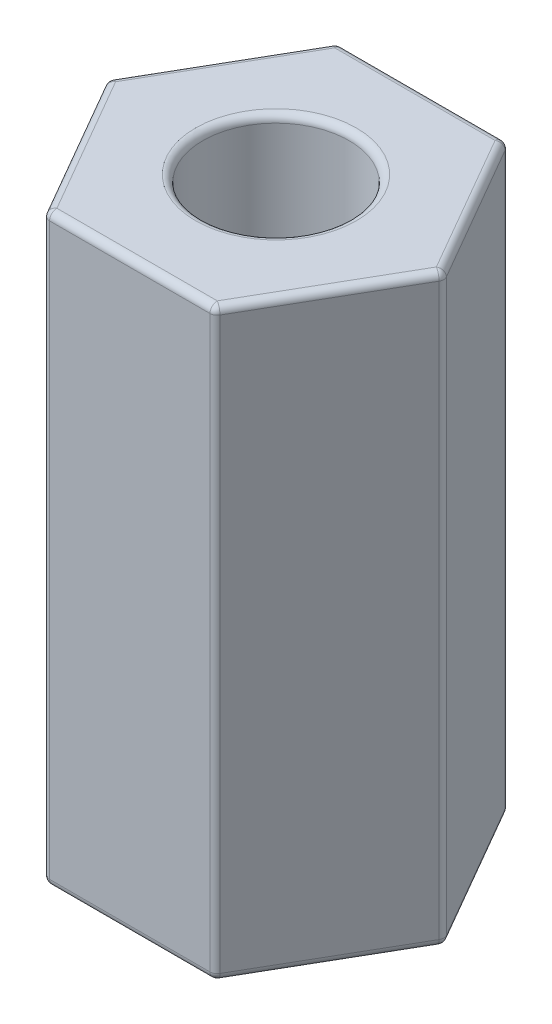
ISO-10303-21;
HEADER;
FILE_DESCRIPTION(('STEP AP214'),'2;1');
FILE_NAME('part.step','',(''),(''),'','','');
FILE_SCHEMA(('AUTOMOTIVE_DESIGN { 1 0 10303 214 1 1 1 1 }'));
ENDSEC;
DATA;
#1=APPLICATION_CONTEXT('core data for automotive mechanical design processes');
#2=APPLICATION_PROTOCOL_DEFINITION('international standard','automotive_design',2000,#1);
#3=PRODUCT_CONTEXT('',#1,'mechanical');
#4=PRODUCT('Part','Part','',(#3));
#5=PRODUCT_RELATED_PRODUCT_CATEGORY('part','',(#4));
#6=PRODUCT_DEFINITION_FORMATION('','',#4);
#7=PRODUCT_DEFINITION_CONTEXT('part definition',#1,'design');
#8=PRODUCT_DEFINITION('design','',#6,#7);
#9=PRODUCT_DEFINITION_SHAPE('','',#8);
#10=(LENGTH_UNIT() NAMED_UNIT(*) SI_UNIT(.MILLI.,.METRE.));
#11=(NAMED_UNIT(*) PLANE_ANGLE_UNIT() SI_UNIT($,.RADIAN.));
#12=(NAMED_UNIT(*) SI_UNIT($,.STERADIAN.) SOLID_ANGLE_UNIT());
#13=UNCERTAINTY_MEASURE_WITH_UNIT(LENGTH_MEASURE(1.E-05),#10,'distance_accuracy_value','');
#14=(GEOMETRIC_REPRESENTATION_CONTEXT(3) GLOBAL_UNCERTAINTY_ASSIGNED_CONTEXT((#13)) GLOBAL_UNIT_ASSIGNED_CONTEXT((#10,
#11,#12)) REPRESENTATION_CONTEXT('',''));
#15=CARTESIAN_POINT('',(0.,0.,0.));
#16=DIRECTION('',(0.,0.,1.));
#17=DIRECTION('',(1.,0.,0.));
#18=AXIS2_PLACEMENT_3D('',#15,#16,#17);
#19=CARTESIAN_POINT('',(-1.154700538379,0.,2.));
#20=DIRECTION('',(0.,0.,1.));
#21=DIRECTION('',(1.,0.,0.));
#22=AXIS2_PLACEMENT_3D('',#19,#20,#21);
#23=PLANE('',#22);
#24=DIRECTION('',(0.,1.,0.));
#25=VECTOR('',#24,1.);
#26=CARTESIAN_POINT('',(-1.09696551146074,0.,2.));
#27=LINE('',#26,#25);
#28=CARTESIAN_POINT('',(-1.09696551146074,7.9,2.));
#29=VERTEX_POINT('',#28);
#30=CARTESIAN_POINT('',(-1.09696551146074,0.1,2.));
#31=VERTEX_POINT('',#30);
#32=EDGE_CURVE('E350',#29,#31,#27,.F.);
#33=ORIENTED_EDGE('',*,*,#32,.T.);
#34=DIRECTION('',(1.,0.,0.));
#35=VECTOR('',#34,1.);
#36=CARTESIAN_POINT('',(1.09696551146004,0.1,2.));
#37=LINE('',#36,#35);
#38=CARTESIAN_POINT('',(1.09696551146004,0.1,2.));
#39=VERTEX_POINT('',#38);
#40=EDGE_CURVE('E319',#31,#39,#37,.T.);
#41=ORIENTED_EDGE('',*,*,#40,.T.);
#42=DIRECTION('',(0.,-1.,0.));
#43=VECTOR('',#42,1.);
#44=CARTESIAN_POINT('',(1.09696551146004,0.,2.));
#45=LINE('',#44,#43);
#46=CARTESIAN_POINT('',(1.09696551146004,7.9,2.));
#47=VERTEX_POINT('',#46);
#48=EDGE_CURVE('E353',#39,#47,#45,.F.);
#49=ORIENTED_EDGE('',*,*,#48,.T.);
#50=DIRECTION('',(1.,0.,0.));
#51=VECTOR('',#50,1.);
#52=CARTESIAN_POINT('',(-1.154700538379,7.9,2.));
#53=LINE('',#52,#51);
#54=EDGE_CURVE('E321',#47,#29,#53,.F.);
#55=ORIENTED_EDGE('',*,*,#54,.T.);
#56=EDGE_LOOP('',(#33,#41,#49,#55));
#57=FACE_BOUND('',#56,.T.);
#58=ADVANCED_FACE('F33',(#57),#23,.T.);
#59=CARTESIAN_POINT('',(1.154700538379,0.,2.));
#60=DIRECTION('',(0.866025403784429,0.,0.500000000000017));
#61=DIRECTION('',(0.500000000000017,0.,-0.866025403784429));
#62=AXIS2_PLACEMENT_3D('',#59,#60,#61);
#63=PLANE('',#62);
#64=DIRECTION('',(0.,-1.,0.));
#65=VECTOR('',#64,1.);
#66=CARTESIAN_POINT('',(1.18356805183848,0.,1.95));
#67=LINE('',#66,#65);
#68=CARTESIAN_POINT('',(1.18356805183848,7.9,1.95));
#69=VERTEX_POINT('',#68);
#70=CARTESIAN_POINT('',(1.18356805183848,0.1,1.95));
#71=VERTEX_POINT('',#70);
#72=EDGE_CURVE('E344',#69,#71,#67,.T.);
#73=ORIENTED_EDGE('',*,*,#72,.T.);
#74=DIRECTION('',(0.500000000000017,0.,-0.866025403784429));
#75=VECTOR('',#74,1.);
#76=CARTESIAN_POINT('',(2.28053356329917,0.1,0.0499999999993974));
#77=LINE('',#76,#75);
#78=CARTESIAN_POINT('',(2.28053356329917,0.1,0.049999999999398));
#79=VERTEX_POINT('',#78);
#80=EDGE_CURVE('E311',#71,#79,#77,.T.);
#81=ORIENTED_EDGE('',*,*,#80,.T.);
#82=DIRECTION('',(0.,-1.,0.));
#83=VECTOR('',#82,1.);
#84=CARTESIAN_POINT('',(2.28053356329917,0.,0.049999999999398));
#85=LINE('',#84,#83);
#86=CARTESIAN_POINT('',(2.28053356329917,7.9,0.049999999999398));
#87=VERTEX_POINT('',#86);
#88=EDGE_CURVE('E347',#79,#87,#85,.F.);
#89=ORIENTED_EDGE('',*,*,#88,.T.);
#90=DIRECTION('',(0.500000000000017,0.,-0.866025403784429));
#91=VECTOR('',#90,1.);
#92=CARTESIAN_POINT('',(1.154700538379,7.9,2.));
#93=LINE('',#92,#91);
#94=EDGE_CURVE('E313',#87,#69,#93,.F.);
#95=ORIENTED_EDGE('',*,*,#94,.T.);
#96=EDGE_LOOP('',(#73,#81,#89,#95));
#97=FACE_BOUND('',#96,.T.);
#98=ADVANCED_FACE('F461',(#97),#63,.T.);
#99=CARTESIAN_POINT('',(2.309401076759,0.,0.));
#100=DIRECTION('',(0.866025403784429,0.,-0.500000000000017));
#101=DIRECTION('',(-0.500000000000017,0.,-0.866025403784429));
#102=AXIS2_PLACEMENT_3D('',#99,#100,#101);
#103=PLANE('',#102);
#104=DIRECTION('',(0.,-1.,0.));
#105=VECTOR('',#104,1.);
#106=CARTESIAN_POINT('',(2.28053356329917,0.,-0.0500000000006048));
#107=LINE('',#106,#105);
#108=CARTESIAN_POINT('',(2.28053356329917,7.9,-0.0500000000006048));
#109=VERTEX_POINT('',#108);
#110=CARTESIAN_POINT('',(2.28053356329917,0.1,-0.0500000000006048));
#111=VERTEX_POINT('',#110);
#112=EDGE_CURVE('E359',#109,#111,#107,.T.);
#113=ORIENTED_EDGE('',*,*,#112,.T.);
#114=DIRECTION('',(-0.500000000000017,0.,-0.866025403784429));
#115=VECTOR('',#114,1.);
#116=CARTESIAN_POINT('',(1.18356805183918,0.1,-1.95));
#117=LINE('',#116,#115);
#118=CARTESIAN_POINT('',(1.18356805183918,0.1,-1.95));
#119=VERTEX_POINT('',#118);
#120=EDGE_CURVE('E303',#111,#119,#117,.T.);
#121=ORIENTED_EDGE('',*,*,#120,.T.);
#122=DIRECTION('',(0.,-1.,0.));
#123=VECTOR('',#122,1.);
#124=CARTESIAN_POINT('',(1.18356805183918,0.,-1.95));
#125=LINE('',#124,#123);
#126=CARTESIAN_POINT('',(1.18356805183918,7.9,-1.95));
#127=VERTEX_POINT('',#126);
#128=EDGE_CURVE('E356',#119,#127,#125,.F.);
#129=ORIENTED_EDGE('',*,*,#128,.T.);
#130=DIRECTION('',(-0.500000000000017,0.,-0.866025403784429));
#131=VECTOR('',#130,1.);
#132=CARTESIAN_POINT('',(2.309401076759,7.9,0.));
#133=LINE('',#132,#131);
#134=EDGE_CURVE('E305',#127,#109,#133,.F.);
#135=ORIENTED_EDGE('',*,*,#134,.T.);
#136=EDGE_LOOP('',(#113,#121,#129,#135));
#137=FACE_BOUND('',#136,.T.);
#138=ADVANCED_FACE('F416',(#137),#103,.T.);
#139=CARTESIAN_POINT('',(1.154700538379,0.,-2.));
#140=DIRECTION('',(0.,0.,-1.));
#141=DIRECTION('',(-1.,0.,0.));
#142=AXIS2_PLACEMENT_3D('',#139,#140,#141);
#143=PLANE('',#142);
#144=DIRECTION('',(0.,-1.,0.));
#145=VECTOR('',#144,1.);
#146=CARTESIAN_POINT('',(1.09696551146074,0.,-2.));
#147=LINE('',#146,#145);
#148=CARTESIAN_POINT('',(1.09696551146074,7.9,-2.));
#149=VERTEX_POINT('',#148);
#150=CARTESIAN_POINT('',(1.09696551146074,0.1,-2.));
#151=VERTEX_POINT('',#150);
#152=EDGE_CURVE('E370',#149,#151,#147,.T.);
#153=ORIENTED_EDGE('',*,*,#152,.T.);
#154=DIRECTION('',(-1.,0.,0.));
#155=VECTOR('',#154,1.);
#156=CARTESIAN_POINT('',(-1.09696551146004,0.1,-2.));
#157=LINE('',#156,#155);
#158=CARTESIAN_POINT('',(-1.09696551146004,0.1,-2.));
#159=VERTEX_POINT('',#158);
#160=EDGE_CURVE('E294',#151,#159,#157,.T.);
#161=ORIENTED_EDGE('',*,*,#160,.T.);
#162=DIRECTION('',(0.,-1.,0.));
#163=VECTOR('',#162,1.);
#164=CARTESIAN_POINT('',(-1.09696551146004,0.,-2.));
#165=LINE('',#164,#163);
#166=CARTESIAN_POINT('',(-1.09696551146004,7.9,-2.));
#167=VERTEX_POINT('',#166);
#168=EDGE_CURVE('E367',#159,#167,#165,.F.);
#169=ORIENTED_EDGE('',*,*,#168,.T.);
#170=DIRECTION('',(-1.,0.,0.));
#171=VECTOR('',#170,1.);
#172=CARTESIAN_POINT('',(1.154700538379,7.9,-2.));
#173=LINE('',#172,#171);
#174=EDGE_CURVE('E296',#167,#149,#173,.F.);
#175=ORIENTED_EDGE('',*,*,#174,.T.);
#176=EDGE_LOOP('',(#153,#161,#169,#175));
#177=FACE_BOUND('',#176,.T.);
#178=ADVANCED_FACE('F376',(#177),#143,.T.);
#179=CARTESIAN_POINT('',(-1.154700538379,0.,-2.));
#180=DIRECTION('',(-0.866025403784429,0.,-0.500000000000017));
#181=DIRECTION('',(-0.500000000000017,0.,0.866025403784429));
#182=AXIS2_PLACEMENT_3D('',#179,#180,#181);
#183=PLANE('',#182);
#184=DIRECTION('',(0.,-1.,0.));
#185=VECTOR('',#184,1.);
#186=CARTESIAN_POINT('',(-1.18356805183848,0.,-1.95));
#187=LINE('',#186,#185);
#188=CARTESIAN_POINT('',(-1.18356805183848,7.9,-1.95));
#189=VERTEX_POINT('',#188);
#190=CARTESIAN_POINT('',(-1.18356805183848,0.1,-1.95));
#191=VERTEX_POINT('',#190);
#192=EDGE_CURVE('E165',#189,#191,#187,.T.);
#193=ORIENTED_EDGE('',*,*,#192,.T.);
#194=DIRECTION('',(-0.500000000000017,0.,0.866025403784429));
#195=VECTOR('',#194,1.);
#196=CARTESIAN_POINT('',(-2.28053356329917,0.1,-0.0499999999993974));
#197=LINE('',#196,#195);
#198=CARTESIAN_POINT('',(-2.28053356329917,0.1,-0.049999999999398));
#199=VERTEX_POINT('',#198);
#200=EDGE_CURVE('E159',#191,#199,#197,.T.);
#201=ORIENTED_EDGE('',*,*,#200,.T.);
#202=DIRECTION('',(0.,-1.,0.));
#203=VECTOR('',#202,1.);
#204=CARTESIAN_POINT('',(-2.28053356329917,0.,-0.049999999999398));
#205=LINE('',#204,#203);
#206=CARTESIAN_POINT('',(-2.28053356329917,7.9,-0.049999999999398));
#207=VERTEX_POINT('',#206);
#208=EDGE_CURVE('E162',#199,#207,#205,.F.);
#209=ORIENTED_EDGE('',*,*,#208,.T.);
#210=DIRECTION('',(-0.500000000000017,0.,0.866025403784429));
#211=VECTOR('',#210,1.);
#212=CARTESIAN_POINT('',(-1.154700538379,7.9,-2.));
#213=LINE('',#212,#211);
#214=EDGE_CURVE('E171',#207,#189,#213,.F.);
#215=ORIENTED_EDGE('',*,*,#214,.T.);
#216=EDGE_LOOP('',(#193,#201,#209,#215));
#217=FACE_BOUND('',#216,.T.);
#218=ADVANCED_FACE('F161',(#217),#183,.T.);
#219=CARTESIAN_POINT('',(-2.309401076759,0.,0.));
#220=DIRECTION('',(-0.866025403784429,0.,0.500000000000017));
#221=DIRECTION('',(0.500000000000017,0.,0.866025403784429));
#222=AXIS2_PLACEMENT_3D('',#219,#220,#221);
#223=PLANE('',#222);
#224=DIRECTION('',(0.,-1.,0.));
#225=VECTOR('',#224,1.);
#226=CARTESIAN_POINT('',(-2.28053356329917,0.,0.0500000000006048));
#227=LINE('',#226,#225);
#228=CARTESIAN_POINT('',(-2.28053356329917,7.9,0.0500000000006048));
#229=VERTEX_POINT('',#228);
#230=CARTESIAN_POINT('',(-2.28053356329917,0.1,0.0500000000006048));
#231=VERTEX_POINT('',#230);
#232=EDGE_CURVE('E362',#229,#231,#227,.T.);
#233=ORIENTED_EDGE('',*,*,#232,.T.);
#234=DIRECTION('',(0.500000000000017,0.,0.866025403784429));
#235=VECTOR('',#234,1.);
#236=CARTESIAN_POINT('',(-1.18356805183918,0.1,1.95));
#237=LINE('',#236,#235);
#238=CARTESIAN_POINT('',(-1.18356805183918,0.1,1.95));
#239=VERTEX_POINT('',#238);
#240=EDGE_CURVE('E340',#231,#239,#237,.T.);
#241=ORIENTED_EDGE('',*,*,#240,.T.);
#242=DIRECTION('',(0.,1.,0.));
#243=VECTOR('',#242,1.);
#244=CARTESIAN_POINT('',(-1.18356805183918,0.,1.95));
#245=LINE('',#244,#243);
#246=CARTESIAN_POINT('',(-1.18356805183918,7.9,1.95));
#247=VERTEX_POINT('',#246);
#248=EDGE_CURVE('E364',#239,#247,#245,.T.);
#249=ORIENTED_EDGE('',*,*,#248,.T.);
#250=DIRECTION('',(0.500000000000017,0.,0.866025403784429));
#251=VECTOR('',#250,1.);
#252=CARTESIAN_POINT('',(-2.309401076759,7.9,0.));
#253=LINE('',#252,#251);
#254=EDGE_CURVE('E190',#247,#229,#253,.F.);
#255=ORIENTED_EDGE('',*,*,#254,.T.);
#256=EDGE_LOOP('',(#233,#241,#249,#255));
#257=FACE_BOUND('',#256,.T.);
#258=ADVANCED_FACE('F436',(#257),#223,.T.);
#259=CARTESIAN_POINT('',(0.,0.,0.));
#260=DIRECTION('',(0.,1.,0.));
#261=DIRECTION('',(0.,0.,1.));
#262=AXIS2_PLACEMENT_3D('',#259,#260,#261);
#263=PLANE('',#262);
#264=DIRECTION('',(1.,0.,0.));
#265=VECTOR('',#264,1.);
#266=CARTESIAN_POINT('',(-1.09696551146074,0.,1.9));
#267=LINE('',#266,#265);
#268=CARTESIAN_POINT('',(1.09696551146004,0.,1.9));
#269=VERTEX_POINT('',#268);
#270=CARTESIAN_POINT('',(-1.09696551146074,0.,1.9));
#271=VERTEX_POINT('',#270);
#272=EDGE_CURVE('E328',#269,#271,#267,.F.);
#273=ORIENTED_EDGE('',*,*,#272,.T.);
#274=DIRECTION('',(0.500000000000017,0.,0.866025403784429));
#275=VECTOR('',#274,1.);
#276=CARTESIAN_POINT('',(-2.19393102292073,0.,6.03053577127172E-13));
#277=LINE('',#276,#275);
#278=CARTESIAN_POINT('',(-2.19393102292073,0.,6.03385614042495E-13));
#279=VERTEX_POINT('',#278);
#280=EDGE_CURVE('E326',#271,#279,#277,.F.);
#281=ORIENTED_EDGE('',*,*,#280,.T.);
#282=DIRECTION('',(-0.500000000000017,0.,0.866025403784429));
#283=VECTOR('',#282,1.);
#284=CARTESIAN_POINT('',(-1.09696551146004,0.,-1.9));
#285=LINE('',#284,#283);
#286=CARTESIAN_POINT('',(-1.09696551146004,0.,-1.9));
#287=VERTEX_POINT('',#286);
#288=EDGE_CURVE('E194',#279,#287,#285,.F.);
#289=ORIENTED_EDGE('',*,*,#288,.T.);
#290=DIRECTION('',(-1.,0.,0.));
#291=VECTOR('',#290,1.);
#292=CARTESIAN_POINT('',(1.09696551146074,0.,-1.9));
#293=LINE('',#292,#291);
#294=CARTESIAN_POINT('',(1.09696551146074,0.,-1.9));
#295=VERTEX_POINT('',#294);
#296=EDGE_CURVE('E334',#287,#295,#293,.F.);
#297=ORIENTED_EDGE('',*,*,#296,.T.);
#298=DIRECTION('',(-0.500000000000017,0.,-0.866025403784429));
#299=VECTOR('',#298,1.);
#300=CARTESIAN_POINT('',(2.19393102292073,0.,-6.03053577127172E-13));
#301=LINE('',#300,#299);
#302=CARTESIAN_POINT('',(2.19393102292073,0.,-6.03221289650728E-13));
#303=VERTEX_POINT('',#302);
#304=EDGE_CURVE('E332',#295,#303,#301,.F.);
#305=ORIENTED_EDGE('',*,*,#304,.T.);
#306=DIRECTION('',(0.500000000000017,0.,-0.866025403784429));
#307=VECTOR('',#306,1.);
#308=CARTESIAN_POINT('',(1.09696551146004,0.,1.9));
#309=LINE('',#308,#307);
#310=EDGE_CURVE('E330',#303,#269,#309,.F.);
#311=ORIENTED_EDGE('',*,*,#310,.T.);
#312=EDGE_LOOP('',(#273,#281,#289,#297,#305,#311));
#313=FACE_BOUND('',#312,.T.);
#314=CARTESIAN_POINT('',(0.,0.,0.));
#315=DIRECTION('',(0.,1.,0.));
#316=DIRECTION('',(0.,0.,1.));
#317=AXIS2_PLACEMENT_3D('',#314,#315,#316);
#318=CIRCLE('',#317,1.1);
#319=CARTESIAN_POINT('',(0.,0.,1.1));
#320=VERTEX_POINT('',#319);
#321=EDGE_CURVE('E337',#320,#320,#318,.T.);
#322=ORIENTED_EDGE('',*,*,#321,.T.);
#323=EDGE_LOOP('',(#322));
#324=FACE_BOUND('',#323,.T.);
#325=ADVANCED_FACE('F424',(#313,#324),#263,.F.);
#326=CARTESIAN_POINT('',(0.,8.,0.));
#327=DIRECTION('',(0.,1.,0.));
#328=DIRECTION('',(0.,0.,1.));
#329=AXIS2_PLACEMENT_3D('',#326,#327,#328);
#330=PLANE('',#329);
#331=DIRECTION('',(0.500000000000017,0.,-0.866025403784429));
#332=VECTOR('',#331,1.);
#333=CARTESIAN_POINT('',(1.64544826719025,8.,0.949999999999934));
#334=LINE('',#333,#332);
#335=CARTESIAN_POINT('',(1.09696551146004,8.,1.9));
#336=VERTEX_POINT('',#335);
#337=CARTESIAN_POINT('',(2.19393102292073,8.,-6.03191048454075E-13));
#338=VERTEX_POINT('',#337);
#339=EDGE_CURVE('E42',#336,#338,#334,.T.);
#340=ORIENTED_EDGE('',*,*,#339,.T.);
#341=DIRECTION('',(-0.500000000000017,0.,-0.866025403784429));
#342=VECTOR('',#341,1.);
#343=CARTESIAN_POINT('',(1.64544826719077,8.,-0.950000000000236));
#344=LINE('',#343,#342);
#345=CARTESIAN_POINT('',(1.09696551146074,8.,-1.9));
#346=VERTEX_POINT('',#345);
#347=EDGE_CURVE('E11',#338,#346,#344,.T.);
#348=ORIENTED_EDGE('',*,*,#347,.T.);
#349=DIRECTION('',(-1.,0.,0.));
#350=VECTOR('',#349,1.);
#351=CARTESIAN_POINT('',(0.,8.,-1.9));
#352=LINE('',#351,#350);
#353=CARTESIAN_POINT('',(-1.09696551146004,8.,-1.9));
#354=VERTEX_POINT('',#353);
#355=EDGE_CURVE('E279',#346,#354,#352,.T.);
#356=ORIENTED_EDGE('',*,*,#355,.T.);
#357=DIRECTION('',(-0.500000000000017,0.,0.866025403784429));
#358=VECTOR('',#357,1.);
#359=CARTESIAN_POINT('',(-1.64544826719025,8.,-0.949999999999934));
#360=LINE('',#359,#358);
#361=CARTESIAN_POINT('',(-2.19393102292073,8.,6.03191048454075E-13));
#362=VERTEX_POINT('',#361);
#363=EDGE_CURVE('E275',#354,#362,#360,.T.);
#364=ORIENTED_EDGE('',*,*,#363,.T.);
#365=DIRECTION('',(0.500000000000017,0.,0.866025403784429));
#366=VECTOR('',#365,1.);
#367=CARTESIAN_POINT('',(-1.64544826719077,8.,0.950000000000236));
#368=LINE('',#367,#366);
#369=CARTESIAN_POINT('',(-1.09696551146074,8.,1.9));
#370=VERTEX_POINT('',#369);
#371=EDGE_CURVE('E265',#362,#370,#368,.T.);
#372=ORIENTED_EDGE('',*,*,#371,.T.);
#373=DIRECTION('',(1.,0.,0.));
#374=VECTOR('',#373,1.);
#375=CARTESIAN_POINT('',(0.,8.,1.9));
#376=LINE('',#375,#374);
#377=EDGE_CURVE('E53',#370,#336,#376,.T.);
#378=ORIENTED_EDGE('',*,*,#377,.T.);
#379=EDGE_LOOP('',(#340,#348,#356,#364,#372,#378));
#380=FACE_BOUND('',#379,.T.);
#381=CARTESIAN_POINT('',(0.,8.,0.));
#382=DIRECTION('',(0.,1.,0.));
#383=DIRECTION('',(0.,0.,1.));
#384=AXIS2_PLACEMENT_3D('',#381,#382,#383);
#385=CIRCLE('',#384,1.1);
#386=CARTESIAN_POINT('',(0.,8.,1.1));
#387=VERTEX_POINT('',#386);
#388=EDGE_CURVE('E281',#387,#387,#385,.F.);
#389=ORIENTED_EDGE('',*,*,#388,.T.);
#390=EDGE_LOOP('',(#389));
#391=FACE_BOUND('',#390,.T.);
#392=ADVANCED_FACE('F481',(#380,#391),#330,.T.);
#393=CARTESIAN_POINT('',(0.,0.,0.));
#394=DIRECTION('',(0.,1.,0.));
#395=DIRECTION('',(0.,0.,1.));
#396=AXIS2_PLACEMENT_3D('',#393,#394,#395);
#397=CYLINDRICAL_SURFACE('',#396,1.);
#398=CARTESIAN_POINT('',(0.,0.1,0.));
#399=DIRECTION('',(0.,1.,0.));
#400=DIRECTION('',(0.,0.,1.));
#401=AXIS2_PLACEMENT_3D('',#398,#399,#400);
#402=CIRCLE('',#401,1.);
#403=CARTESIAN_POINT('',(0.,0.1,1.));
#404=VERTEX_POINT('',#403);
#405=EDGE_CURVE('E284',#404,#404,#402,.F.);
#406=ORIENTED_EDGE('',*,*,#405,.T.);
#407=EDGE_LOOP('',(#406));
#408=FACE_BOUND('',#407,.T.);
#409=CARTESIAN_POINT('',(0.,7.9,0.));
#410=DIRECTION('',(0.,1.,0.));
#411=DIRECTION('',(0.,0.,1.));
#412=AXIS2_PLACEMENT_3D('',#409,#410,#411);
#413=CIRCLE('',#412,1.);
#414=CARTESIAN_POINT('',(0.,7.9,1.));
#415=VERTEX_POINT('',#414);
#416=EDGE_CURVE('E170',#415,#415,#413,.T.);
#417=ORIENTED_EDGE('',*,*,#416,.T.);
#418=EDGE_LOOP('',(#417));
#419=FACE_BOUND('',#418,.T.);
#420=ADVANCED_FACE('F479',(#408,#419),#397,.F.);
#421=CARTESIAN_POINT('',(-1.09696551146004,0.,-1.9));
#422=DIRECTION('',(0.,-1.,0.));
#423=DIRECTION('',(0.,0.,-1.));
#424=AXIS2_PLACEMENT_3D('',#421,#422,#423);
#425=CYLINDRICAL_SURFACE('',#424,0.1);
#426=ORIENTED_EDGE('',*,*,#168,.F.);
#427=CARTESIAN_POINT('',(-1.09696551146004,0.1,-1.9));
#428=DIRECTION('',(0.,-1.,0.));
#429=DIRECTION('',(0.,0.,-1.));
#430=AXIS2_PLACEMENT_3D('',#427,#428,#429);
#431=CIRCLE('',#430,0.1);
#432=EDGE_CURVE('E290',#159,#191,#431,.F.);
#433=ORIENTED_EDGE('',*,*,#432,.T.);
#434=ORIENTED_EDGE('',*,*,#192,.F.);
#435=CARTESIAN_POINT('',(-1.09696551146004,7.9,-1.9));
#436=DIRECTION('',(0.,-1.,0.));
#437=DIRECTION('',(0.,0.,-1.));
#438=AXIS2_PLACEMENT_3D('',#435,#436,#437);
#439=CIRCLE('',#438,0.1);
#440=EDGE_CURVE('E292',#189,#167,#439,.T.);
#441=ORIENTED_EDGE('',*,*,#440,.T.);
#442=EDGE_LOOP('',(#426,#433,#434,#441));
#443=FACE_BOUND('',#442,.T.);
#444=ADVANCED_FACE('F394',(#443),#425,.T.);
#445=CARTESIAN_POINT('',(-2.19393102292073,0.,6.03277193825247E-13));
#446=DIRECTION('',(0.,-1.,0.));
#447=DIRECTION('',(0.,0.,-1.));
#448=AXIS2_PLACEMENT_3D('',#445,#446,#447);
#449=CYLINDRICAL_SURFACE('',#448,0.1);
#450=ORIENTED_EDGE('',*,*,#208,.F.);
#451=CARTESIAN_POINT('',(-2.19393102292073,0.1,6.03277193825247E-13));
#452=DIRECTION('',(0.,-1.,0.));
#453=DIRECTION('',(0.,0.,-1.));
#454=AXIS2_PLACEMENT_3D('',#451,#452,#453);
#455=CIRCLE('',#454,0.1);
#456=EDGE_CURVE('E178',#199,#231,#455,.F.);
#457=ORIENTED_EDGE('',*,*,#456,.T.);
#458=ORIENTED_EDGE('',*,*,#232,.F.);
#459=CARTESIAN_POINT('',(-2.19393102292073,7.9,6.03277193825247E-13));
#460=DIRECTION('',(0.,-1.,0.));
#461=DIRECTION('',(0.,0.,-1.));
#462=AXIS2_PLACEMENT_3D('',#459,#460,#461);
#463=CIRCLE('',#462,0.1);
#464=EDGE_CURVE('E181',#229,#207,#463,.T.);
#465=ORIENTED_EDGE('',*,*,#464,.T.);
#466=EDGE_LOOP('',(#450,#457,#458,#465));
#467=FACE_BOUND('',#466,.T.);
#468=ADVANCED_FACE('F176',(#467),#449,.T.);
#469=CARTESIAN_POINT('',(1.09696551146074,0.,-1.9));
#470=DIRECTION('',(0.,-1.,0.));
#471=DIRECTION('',(0.,0.,-1.));
#472=AXIS2_PLACEMENT_3D('',#469,#470,#471);
#473=CYLINDRICAL_SURFACE('',#472,0.1);
#474=ORIENTED_EDGE('',*,*,#128,.F.);
#475=CARTESIAN_POINT('',(1.09696551146074,0.1,-1.9));
#476=DIRECTION('',(0.,-1.,0.));
#477=DIRECTION('',(0.,0.,-1.));
#478=AXIS2_PLACEMENT_3D('',#475,#476,#477);
#479=CIRCLE('',#478,0.1);
#480=EDGE_CURVE('E298',#119,#151,#479,.F.);
#481=ORIENTED_EDGE('',*,*,#480,.T.);
#482=ORIENTED_EDGE('',*,*,#152,.F.);
#483=CARTESIAN_POINT('',(1.09696551146074,7.9,-1.9));
#484=DIRECTION('',(0.,-1.,0.));
#485=DIRECTION('',(0.,0.,-1.));
#486=AXIS2_PLACEMENT_3D('',#483,#484,#485);
#487=CIRCLE('',#486,0.1);
#488=EDGE_CURVE('E300',#149,#127,#487,.T.);
#489=ORIENTED_EDGE('',*,*,#488,.T.);
#490=EDGE_LOOP('',(#474,#481,#482,#489));
#491=FACE_BOUND('',#490,.T.);
#492=ADVANCED_FACE('F415',(#491),#473,.T.);
#493=CARTESIAN_POINT('',(-1.09696551146074,0.,1.9));
#494=DIRECTION('',(0.,1.,0.));
#495=DIRECTION('',(0.,0.,1.));
#496=AXIS2_PLACEMENT_3D('',#493,#494,#495);
#497=CYLINDRICAL_SURFACE('',#496,0.1);
#498=ORIENTED_EDGE('',*,*,#248,.F.);
#499=CARTESIAN_POINT('',(-1.09696551146074,0.1,1.9));
#500=DIRECTION('',(0.,1.,0.));
#501=DIRECTION('',(0.,0.,1.));
#502=AXIS2_PLACEMENT_3D('',#499,#500,#501);
#503=CIRCLE('',#502,0.1);
#504=EDGE_CURVE('E323',#239,#31,#503,.T.);
#505=ORIENTED_EDGE('',*,*,#504,.T.);
#506=ORIENTED_EDGE('',*,*,#32,.F.);
#507=CARTESIAN_POINT('',(-1.09696551146074,7.9,1.9));
#508=DIRECTION('',(0.,1.,0.));
#509=DIRECTION('',(0.,0.,1.));
#510=AXIS2_PLACEMENT_3D('',#507,#508,#509);
#511=CIRCLE('',#510,0.1);
#512=EDGE_CURVE('E269',#29,#247,#511,.F.);
#513=ORIENTED_EDGE('',*,*,#512,.T.);
#514=EDGE_LOOP('',(#498,#505,#506,#513));
#515=FACE_BOUND('',#514,.T.);
#516=ADVANCED_FACE('F439',(#515),#497,.T.);
#517=CARTESIAN_POINT('',(1.09696551146004,0.,1.9));
#518=DIRECTION('',(0.,-1.,0.));
#519=DIRECTION('',(0.,0.,-1.));
#520=AXIS2_PLACEMENT_3D('',#517,#518,#519);
#521=CYLINDRICAL_SURFACE('',#520,0.1);
#522=ORIENTED_EDGE('',*,*,#48,.F.);
#523=CARTESIAN_POINT('',(1.09696551146004,0.1,1.9));
#524=DIRECTION('',(0.,-1.,0.));
#525=DIRECTION('',(0.,0.,-1.));
#526=AXIS2_PLACEMENT_3D('',#523,#524,#525);
#527=CIRCLE('',#526,0.1);
#528=EDGE_CURVE('E315',#39,#71,#527,.F.);
#529=ORIENTED_EDGE('',*,*,#528,.T.);
#530=ORIENTED_EDGE('',*,*,#72,.F.);
#531=CARTESIAN_POINT('',(1.09696551146004,7.9,1.9));
#532=DIRECTION('',(0.,-1.,0.));
#533=DIRECTION('',(0.,0.,-1.));
#534=AXIS2_PLACEMENT_3D('',#531,#532,#533);
#535=CIRCLE('',#534,0.1);
#536=EDGE_CURVE('E317',#69,#47,#535,.T.);
#537=ORIENTED_EDGE('',*,*,#536,.T.);
#538=EDGE_LOOP('',(#522,#529,#530,#537));
#539=FACE_BOUND('',#538,.T.);
#540=ADVANCED_FACE('F451',(#539),#521,.T.);
#541=CARTESIAN_POINT('',(2.19393102292073,0.,-6.03277193825247E-13));
#542=DIRECTION('',(0.,-1.,0.));
#543=DIRECTION('',(0.,0.,-1.));
#544=AXIS2_PLACEMENT_3D('',#541,#542,#543);
#545=CYLINDRICAL_SURFACE('',#544,0.1);
#546=ORIENTED_EDGE('',*,*,#88,.F.);
#547=CARTESIAN_POINT('',(2.19393102292073,0.1,-6.03277193825247E-13));
#548=DIRECTION('',(0.,-1.,0.));
#549=DIRECTION('',(0.,0.,-1.));
#550=AXIS2_PLACEMENT_3D('',#547,#548,#549);
#551=CIRCLE('',#550,0.1);
#552=EDGE_CURVE('E307',#79,#111,#551,.F.);
#553=ORIENTED_EDGE('',*,*,#552,.T.);
#554=ORIENTED_EDGE('',*,*,#112,.F.);
#555=CARTESIAN_POINT('',(2.19393102292073,7.9,-6.03277193825247E-13));
#556=DIRECTION('',(0.,-1.,0.));
#557=DIRECTION('',(0.,0.,-1.));
#558=AXIS2_PLACEMENT_3D('',#555,#556,#557);
#559=CIRCLE('',#558,0.1);
#560=EDGE_CURVE('E309',#109,#87,#559,.T.);
#561=ORIENTED_EDGE('',*,*,#560,.T.);
#562=EDGE_LOOP('',(#546,#553,#554,#561));
#563=FACE_BOUND('',#562,.T.);
#564=ADVANCED_FACE('F465',(#563),#545,.T.);
#565=CARTESIAN_POINT('',(2.19393102292073,0.1,-6.03277193825247E-13));
#566=DIRECTION('',(0.,0.,1.));
#567=DIRECTION('',(1.,0.,0.));
#568=AXIS2_PLACEMENT_3D('',#565,#566,#567);
#569=SPHERICAL_SURFACE('',#568,0.1);
#570=CARTESIAN_POINT('',(2.19393102292073,0.1,-6.03209431189466E-13));
#571=DIRECTION('',(-0.500000000000017,0.,-0.866025403784429));
#572=DIRECTION('',(-0.866025403784429,0.,0.500000000000017));
#573=AXIS2_PLACEMENT_3D('',#570,#571,#572);
#574=CIRCLE('',#573,0.1);
#575=EDGE_CURVE('E225',#111,#303,#574,.T.);
#576=ORIENTED_EDGE('',*,*,#575,.F.);
#577=ORIENTED_EDGE('',*,*,#552,.F.);
#578=CARTESIAN_POINT('',(2.19393102292073,0.1,-6.03277193825247E-13));
#579=DIRECTION('',(-0.500000000000013,0.,0.866025403784431));
#580=DIRECTION('',(0.866025403784431,0.,0.500000000000013));
#581=AXIS2_PLACEMENT_3D('',#578,#579,#580);
#582=CIRCLE('',#581,0.1);
#583=EDGE_CURVE('E182',#303,#79,#582,.T.);
#584=ORIENTED_EDGE('',*,*,#583,.F.);
#585=EDGE_LOOP('',(#576,#577,#584));
#586=FACE_BOUND('',#585,.T.);
#587=ADVANCED_FACE('F468',(#586),#569,.T.);
#588=CARTESIAN_POINT('',(1.06809799800056,0.1,1.95));
#589=DIRECTION('',(-0.500000000000017,0.,0.866025403784429));
#590=DIRECTION('',(0.866025403784429,0.,0.500000000000017));
#591=AXIS2_PLACEMENT_3D('',#588,#589,#590);
#592=CYLINDRICAL_SURFACE('',#591,0.1);
#593=ORIENTED_EDGE('',*,*,#583,.T.);
#594=ORIENTED_EDGE('',*,*,#80,.F.);
#595=CARTESIAN_POINT('',(1.09696551146004,0.1,1.9));
#596=DIRECTION('',(-0.500000000000017,0.,0.866025403784429));
#597=DIRECTION('',(0.866025403784429,0.,0.500000000000017));
#598=AXIS2_PLACEMENT_3D('',#595,#596,#597);
#599=CIRCLE('',#598,0.1);
#600=EDGE_CURVE('E222',#269,#71,#599,.T.);
#601=ORIENTED_EDGE('',*,*,#600,.F.);
#602=ORIENTED_EDGE('',*,*,#310,.F.);
#603=EDGE_LOOP('',(#593,#594,#601,#602));
#604=FACE_BOUND('',#603,.T.);
#605=ADVANCED_FACE('F458',(#604),#592,.T.);
#606=CARTESIAN_POINT('',(2.22279853638056,0.1,0.0500000000000017));
#607=DIRECTION('',(0.500000000000017,0.,0.866025403784429));
#608=DIRECTION('',(0.866025403784429,0.,-0.500000000000017));
#609=AXIS2_PLACEMENT_3D('',#606,#607,#608);
#610=CYLINDRICAL_SURFACE('',#609,0.1);
#611=ORIENTED_EDGE('',*,*,#575,.T.);
#612=ORIENTED_EDGE('',*,*,#304,.F.);
#613=CARTESIAN_POINT('',(1.09696551146074,0.1,-1.9));
#614=DIRECTION('',(-0.500000000000017,0.,-0.866025403784429));
#615=DIRECTION('',(-0.866025403784429,0.,0.500000000000017));
#616=AXIS2_PLACEMENT_3D('',#613,#614,#615);
#617=CIRCLE('',#616,0.1);
#618=EDGE_CURVE('E219',#119,#295,#617,.T.);
#619=ORIENTED_EDGE('',*,*,#618,.F.);
#620=ORIENTED_EDGE('',*,*,#120,.F.);
#621=EDGE_LOOP('',(#611,#612,#619,#620));
#622=FACE_BOUND('',#621,.T.);
#623=ADVANCED_FACE('F420',(#622),#610,.T.);
#624=CARTESIAN_POINT('',(1.09696551146004,0.1,1.9));
#625=DIRECTION('',(0.,0.,1.));
#626=DIRECTION('',(1.,0.,0.));
#627=AXIS2_PLACEMENT_3D('',#624,#625,#626);
#628=SPHERICAL_SURFACE('',#627,0.1);
#629=ORIENTED_EDGE('',*,*,#600,.T.);
#630=ORIENTED_EDGE('',*,*,#528,.F.);
#631=CARTESIAN_POINT('',(1.09696551146004,0.1,1.9));
#632=DIRECTION('',(-1.,0.,0.));
#633=DIRECTION('',(0.,0.,1.));
#634=AXIS2_PLACEMENT_3D('',#631,#632,#633);
#635=CIRCLE('',#634,0.1);
#636=EDGE_CURVE('E216',#269,#39,#635,.T.);
#637=ORIENTED_EDGE('',*,*,#636,.F.);
#638=EDGE_LOOP('',(#629,#630,#637));
#639=FACE_BOUND('',#638,.T.);
#640=ADVANCED_FACE('F455',(#639),#628,.T.);
#641=CARTESIAN_POINT('',(1.09696551146074,0.1,-1.9));
#642=DIRECTION('',(0.,0.,1.));
#643=DIRECTION('',(1.,0.,0.));
#644=AXIS2_PLACEMENT_3D('',#641,#642,#643);
#645=SPHERICAL_SURFACE('',#644,0.1);
#646=ORIENTED_EDGE('',*,*,#480,.F.);
#647=ORIENTED_EDGE('',*,*,#618,.T.);
#648=CARTESIAN_POINT('',(1.09696551146074,0.1,-1.9));
#649=DIRECTION('',(-1.,0.,0.));
#650=DIRECTION('',(0.,0.,1.));
#651=AXIS2_PLACEMENT_3D('',#648,#649,#650);
#652=CIRCLE('',#651,0.1);
#653=EDGE_CURVE('E213',#151,#295,#652,.T.);
#654=ORIENTED_EDGE('',*,*,#653,.F.);
#655=EDGE_LOOP('',(#646,#647,#654));
#656=FACE_BOUND('',#655,.T.);
#657=ADVANCED_FACE('F384',(#656),#645,.T.);
#658=CARTESIAN_POINT('',(-1.154700538379,0.1,1.9));
#659=DIRECTION('',(-1.,0.,0.));
#660=DIRECTION('',(0.,0.,1.));
#661=AXIS2_PLACEMENT_3D('',#658,#659,#660);
#662=CYLINDRICAL_SURFACE('',#661,0.1);
#663=ORIENTED_EDGE('',*,*,#636,.T.);
#664=ORIENTED_EDGE('',*,*,#40,.F.);
#665=CARTESIAN_POINT('',(-1.09696551146074,0.1,1.9));
#666=DIRECTION('',(-1.,0.,0.));
#667=DIRECTION('',(0.,0.,1.));
#668=AXIS2_PLACEMENT_3D('',#665,#666,#667);
#669=CIRCLE('',#668,0.1);
#670=EDGE_CURVE('E210',#271,#31,#669,.T.);
#671=ORIENTED_EDGE('',*,*,#670,.F.);
#672=ORIENTED_EDGE('',*,*,#272,.F.);
#673=EDGE_LOOP('',(#663,#664,#671,#672));
#674=FACE_BOUND('',#673,.T.);
#675=ADVANCED_FACE('F445',(#674),#662,.T.);
#676=CARTESIAN_POINT('',(1.154700538379,0.1,-1.9));
#677=DIRECTION('',(1.,0.,0.));
#678=DIRECTION('',(0.,0.,-1.));
#679=AXIS2_PLACEMENT_3D('',#676,#677,#678);
#680=CYLINDRICAL_SURFACE('',#679,0.1);
#681=ORIENTED_EDGE('',*,*,#653,.T.);
#682=ORIENTED_EDGE('',*,*,#296,.F.);
#683=CARTESIAN_POINT('',(-1.09696551146004,0.1,-1.9));
#684=DIRECTION('',(-1.,0.,0.));
#685=DIRECTION('',(0.,0.,1.));
#686=AXIS2_PLACEMENT_3D('',#683,#684,#685);
#687=CIRCLE('',#686,0.1);
#688=EDGE_CURVE('E207',#159,#287,#687,.T.);
#689=ORIENTED_EDGE('',*,*,#688,.F.);
#690=ORIENTED_EDGE('',*,*,#160,.F.);
#691=EDGE_LOOP('',(#681,#682,#689,#690));
#692=FACE_BOUND('',#691,.T.);
#693=ADVANCED_FACE('F389',(#692),#680,.T.);
#694=CARTESIAN_POINT('',(-1.09696551146074,0.1,1.9));
#695=DIRECTION('',(0.,0.,1.));
#696=DIRECTION('',(1.,0.,0.));
#697=AXIS2_PLACEMENT_3D('',#694,#695,#696);
#698=SPHERICAL_SURFACE('',#697,0.1);
#699=ORIENTED_EDGE('',*,*,#670,.T.);
#700=ORIENTED_EDGE('',*,*,#504,.F.);
#701=CARTESIAN_POINT('',(-1.09696551146074,0.1,1.9));
#702=DIRECTION('',(-0.500000000000021,0.,-0.866025403784426));
#703=DIRECTION('',(-0.866025403784427,0.,0.500000000000021));
#704=AXIS2_PLACEMENT_3D('',#701,#702,#703);
#705=CIRCLE('',#704,0.1);
#706=EDGE_CURVE('E204',#271,#239,#705,.T.);
#707=ORIENTED_EDGE('',*,*,#706,.F.);
#708=EDGE_LOOP('',(#699,#700,#707));
#709=FACE_BOUND('',#708,.T.);
#710=ADVANCED_FACE('F442',(#709),#698,.T.);
#711=CARTESIAN_POINT('',(-1.09696551146004,0.1,-1.9));
#712=DIRECTION('',(0.,0.,1.));
#713=DIRECTION('',(1.,0.,0.));
#714=AXIS2_PLACEMENT_3D('',#711,#712,#713);
#715=SPHERICAL_SURFACE('',#714,0.1);
#716=ORIENTED_EDGE('',*,*,#432,.F.);
#717=ORIENTED_EDGE('',*,*,#688,.T.);
#718=CARTESIAN_POINT('',(-1.09696551146004,0.1,-1.9));
#719=DIRECTION('',(-0.500000000000017,0.,0.866025403784429));
#720=DIRECTION('',(0.866025403784429,0.,0.500000000000017));
#721=AXIS2_PLACEMENT_3D('',#718,#719,#720);
#722=CIRCLE('',#721,0.1);
#723=EDGE_CURVE('E197',#191,#287,#722,.T.);
#724=ORIENTED_EDGE('',*,*,#723,.F.);
#725=EDGE_LOOP('',(#716,#717,#724));
#726=FACE_BOUND('',#725,.T.);
#727=ADVANCED_FACE('F392',(#726),#715,.T.);
#728=CARTESIAN_POINT('',(-2.22279853638056,0.1,-0.0500000000000017));
#729=DIRECTION('',(-0.500000000000017,0.,-0.866025403784429));
#730=DIRECTION('',(-0.866025403784429,0.,0.500000000000017));
#731=AXIS2_PLACEMENT_3D('',#728,#729,#730);
#732=CYLINDRICAL_SURFACE('',#731,0.1);
#733=ORIENTED_EDGE('',*,*,#706,.T.);
#734=ORIENTED_EDGE('',*,*,#240,.F.);
#735=CARTESIAN_POINT('',(-2.19393102292073,0.1,6.03221289650728E-13));
#736=DIRECTION('',(-0.500000000000016,0.,-0.866025403784429));
#737=DIRECTION('',(-0.866025403784429,0.,0.500000000000016));
#738=AXIS2_PLACEMENT_3D('',#735,#736,#737);
#739=CIRCLE('',#738,0.1);
#740=EDGE_CURVE('E188',#279,#231,#739,.T.);
#741=ORIENTED_EDGE('',*,*,#740,.F.);
#742=ORIENTED_EDGE('',*,*,#280,.F.);
#743=EDGE_LOOP('',(#733,#734,#741,#742));
#744=FACE_BOUND('',#743,.T.);
#745=ADVANCED_FACE('F432',(#744),#732,.T.);
#746=CARTESIAN_POINT('',(-1.06809799800056,0.1,-1.95));
#747=DIRECTION('',(0.500000000000017,0.,-0.866025403784429));
#748=DIRECTION('',(-0.866025403784429,0.,-0.500000000000017));
#749=AXIS2_PLACEMENT_3D('',#746,#747,#748);
#750=CYLINDRICAL_SURFACE('',#749,0.1);
#751=ORIENTED_EDGE('',*,*,#723,.T.);
#752=ORIENTED_EDGE('',*,*,#288,.F.);
#753=CARTESIAN_POINT('',(-2.19393102292073,0.1,6.03778637330021E-13));
#754=DIRECTION('',(-0.500000000000017,0.,0.866025403784429));
#755=DIRECTION('',(0.866025403784429,0.,0.500000000000017));
#756=AXIS2_PLACEMENT_3D('',#753,#754,#755);
#757=CIRCLE('',#756,0.1);
#758=EDGE_CURVE('E186',#199,#279,#757,.T.);
#759=ORIENTED_EDGE('',*,*,#758,.F.);
#760=ORIENTED_EDGE('',*,*,#200,.F.);
#761=EDGE_LOOP('',(#751,#752,#759,#760));
#762=FACE_BOUND('',#761,.T.);
#763=ADVANCED_FACE('F193',(#762),#750,.T.);
#764=CARTESIAN_POINT('',(-2.19393102292073,0.1,6.03277193825247E-13));
#765=DIRECTION('',(0.,0.,1.));
#766=DIRECTION('',(1.,0.,0.));
#767=AXIS2_PLACEMENT_3D('',#764,#765,#766);
#768=SPHERICAL_SURFACE('',#767,0.1);
#769=ORIENTED_EDGE('',*,*,#740,.T.);
#770=ORIENTED_EDGE('',*,*,#456,.F.);
#771=ORIENTED_EDGE('',*,*,#758,.T.);
#772=EDGE_LOOP('',(#769,#770,#771));
#773=FACE_BOUND('',#772,.T.);
#774=ADVANCED_FACE('F185',(#773),#768,.T.);
#775=CARTESIAN_POINT('',(0.,0.1,0.));
#776=DIRECTION('',(0.,1.,0.));
#777=DIRECTION('',(0.,0.,1.));
#778=AXIS2_PLACEMENT_3D('',#775,#776,#777);
#779=TOROIDAL_SURFACE('',#778,1.1,0.1);
#780=ORIENTED_EDGE('',*,*,#405,.F.);
#781=EDGE_LOOP('',(#780));
#782=FACE_BOUND('',#781,.T.);
#783=ORIENTED_EDGE('',*,*,#321,.F.);
#784=EDGE_LOOP('',(#783));
#785=FACE_BOUND('',#784,.T.);
#786=ADVANCED_FACE('F503',(#782,#785),#779,.T.);
#787=CARTESIAN_POINT('',(-1.09696551146074,7.9,1.9));
#788=DIRECTION('',(0.,0.,1.));
#789=DIRECTION('',(1.,0.,0.));
#790=AXIS2_PLACEMENT_3D('',#787,#788,#789);
#791=SPHERICAL_SURFACE('',#790,0.1);
#792=CARTESIAN_POINT('',(-1.09696551146074,7.9,1.9));
#793=DIRECTION('',(-0.500000000000021,0.,-0.866025403784426));
#794=DIRECTION('',(-0.866025403784427,0.,0.500000000000021));
#795=AXIS2_PLACEMENT_3D('',#792,#793,#794);
#796=CIRCLE('',#795,0.1);
#797=EDGE_CURVE('E200',#247,#370,#796,.T.);
#798=ORIENTED_EDGE('',*,*,#797,.F.);
#799=ORIENTED_EDGE('',*,*,#512,.F.);
#800=CARTESIAN_POINT('',(-1.09696551146074,7.9,1.9));
#801=DIRECTION('',(1.,0.,0.));
#802=DIRECTION('',(0.,0.,-1.));
#803=AXIS2_PLACEMENT_3D('',#800,#801,#802);
#804=CIRCLE('',#803,0.1);
#805=EDGE_CURVE('E37',#370,#29,#804,.T.);
#806=ORIENTED_EDGE('',*,*,#805,.F.);
#807=EDGE_LOOP('',(#798,#799,#806));
#808=FACE_BOUND('',#807,.T.);
#809=ADVANCED_FACE('F268',(#808),#791,.T.);
#810=CARTESIAN_POINT('',(0.,7.9,1.9));
#811=DIRECTION('',(1.,0.,0.));
#812=DIRECTION('',(0.,0.,-1.));
#813=AXIS2_PLACEMENT_3D('',#810,#811,#812);
#814=CYLINDRICAL_SURFACE('',#813,0.1);
#815=ORIENTED_EDGE('',*,*,#805,.T.);
#816=ORIENTED_EDGE('',*,*,#54,.F.);
#817=CARTESIAN_POINT('',(1.09696551146004,7.9,1.9));
#818=DIRECTION('',(1.,0.,0.));
#819=DIRECTION('',(0.,0.,-1.));
#820=AXIS2_PLACEMENT_3D('',#817,#818,#819);
#821=CIRCLE('',#820,0.1);
#822=EDGE_CURVE('E255',#336,#47,#821,.T.);
#823=ORIENTED_EDGE('',*,*,#822,.F.);
#824=ORIENTED_EDGE('',*,*,#377,.F.);
#825=EDGE_LOOP('',(#815,#816,#823,#824));
#826=FACE_BOUND('',#825,.T.);
#827=ADVANCED_FACE('F272',(#826),#814,.T.);
#828=CARTESIAN_POINT('',(-1.64544826719077,7.9,0.950000000000236));
#829=DIRECTION('',(0.500000000000017,0.,0.866025403784429));
#830=DIRECTION('',(0.866025403784429,0.,-0.500000000000017));
#831=AXIS2_PLACEMENT_3D('',#828,#829,#830);
#832=CYLINDRICAL_SURFACE('',#831,0.1);
#833=ORIENTED_EDGE('',*,*,#797,.T.);
#834=ORIENTED_EDGE('',*,*,#371,.F.);
#835=CARTESIAN_POINT('',(-2.19393102292073,7.9,6.03046800863594E-13));
#836=DIRECTION('',(-0.500000000000017,0.,-0.866025403784429));
#837=DIRECTION('',(-0.866025403784429,0.,0.500000000000017));
#838=AXIS2_PLACEMENT_3D('',#835,#836,#837);
#839=CIRCLE('',#838,0.1);
#840=EDGE_CURVE('E252',#229,#362,#839,.T.);
#841=ORIENTED_EDGE('',*,*,#840,.F.);
#842=ORIENTED_EDGE('',*,*,#254,.F.);
#843=EDGE_LOOP('',(#833,#834,#841,#842));
#844=FACE_BOUND('',#843,.T.);
#845=ADVANCED_FACE('F263',(#844),#832,.T.);
#846=CARTESIAN_POINT('',(1.09696551146004,7.9,1.9));
#847=DIRECTION('',(0.,0.,1.));
#848=DIRECTION('',(1.,0.,0.));
#849=AXIS2_PLACEMENT_3D('',#846,#847,#848);
#850=SPHERICAL_SURFACE('',#849,0.1);
#851=ORIENTED_EDGE('',*,*,#822,.T.);
#852=ORIENTED_EDGE('',*,*,#536,.F.);
#853=CARTESIAN_POINT('',(1.09696551146004,7.9,1.9));
#854=DIRECTION('',(0.500000000000017,0.,-0.866025403784429));
#855=DIRECTION('',(-0.866025403784429,0.,-0.500000000000017));
#856=AXIS2_PLACEMENT_3D('',#853,#854,#855);
#857=CIRCLE('',#856,0.1);
#858=EDGE_CURVE('E249',#336,#69,#857,.T.);
#859=ORIENTED_EDGE('',*,*,#858,.F.);
#860=EDGE_LOOP('',(#851,#852,#859));
#861=FACE_BOUND('',#860,.T.);
#862=ADVANCED_FACE('F584',(#861),#850,.T.);
#863=CARTESIAN_POINT('',(-2.19393102292073,7.9,6.03277193825247E-13));
#864=DIRECTION('',(0.,0.,1.));
#865=DIRECTION('',(1.,0.,0.));
#866=AXIS2_PLACEMENT_3D('',#863,#864,#865);
#867=SPHERICAL_SURFACE('',#866,0.1);
#868=ORIENTED_EDGE('',*,*,#464,.F.);
#869=ORIENTED_EDGE('',*,*,#840,.T.);
#870=CARTESIAN_POINT('',(-2.19393102292073,7.9,6.03209431189466E-13));
#871=DIRECTION('',(0.500000000000013,0.,-0.866025403784431));
#872=DIRECTION('',(-0.866025403784431,0.,-0.500000000000013));
#873=AXIS2_PLACEMENT_3D('',#870,#871,#872);
#874=CIRCLE('',#873,0.1);
#875=EDGE_CURVE('E246',#207,#362,#874,.T.);
#876=ORIENTED_EDGE('',*,*,#875,.F.);
#877=EDGE_LOOP('',(#868,#869,#876));
#878=FACE_BOUND('',#877,.T.);
#879=ADVANCED_FACE('F591',(#878),#867,.T.);
#880=CARTESIAN_POINT('',(1.64544826719025,7.9,0.949999999999934));
#881=DIRECTION('',(0.500000000000017,0.,-0.866025403784429));
#882=DIRECTION('',(-0.866025403784429,0.,-0.500000000000017));
#883=AXIS2_PLACEMENT_3D('',#880,#881,#882);
#884=CYLINDRICAL_SURFACE('',#883,0.1);
#885=ORIENTED_EDGE('',*,*,#858,.T.);
#886=ORIENTED_EDGE('',*,*,#94,.F.);
#887=CARTESIAN_POINT('',(2.19393102292073,7.9,-6.03191048454075E-13));
#888=DIRECTION('',(0.500000000000013,0.,-0.866025403784431));
#889=DIRECTION('',(-0.866025403784431,0.,-0.500000000000013));
#890=AXIS2_PLACEMENT_3D('',#887,#888,#889);
#891=CIRCLE('',#890,0.1);
#892=EDGE_CURVE('E243',#338,#87,#891,.T.);
#893=ORIENTED_EDGE('',*,*,#892,.F.);
#894=ORIENTED_EDGE('',*,*,#339,.F.);
#895=EDGE_LOOP('',(#885,#886,#893,#894));
#896=FACE_BOUND('',#895,.T.);
#897=ADVANCED_FACE('F599',(#896),#884,.T.);
#898=CARTESIAN_POINT('',(-1.64544826719025,7.9,-0.949999999999934));
#899=DIRECTION('',(-0.500000000000017,0.,0.866025403784429));
#900=DIRECTION('',(0.866025403784429,0.,0.500000000000017));
#901=AXIS2_PLACEMENT_3D('',#898,#899,#900);
#902=CYLINDRICAL_SURFACE('',#901,0.1);
#903=ORIENTED_EDGE('',*,*,#875,.T.);
#904=ORIENTED_EDGE('',*,*,#363,.F.);
#905=CARTESIAN_POINT('',(-1.09696551146004,7.9,-1.9));
#906=DIRECTION('',(0.500000000000017,0.,-0.866025403784429));
#907=DIRECTION('',(-0.866025403784429,0.,-0.500000000000017));
#908=AXIS2_PLACEMENT_3D('',#905,#906,#907);
#909=CIRCLE('',#908,0.1);
#910=EDGE_CURVE('E240',#189,#354,#909,.T.);
#911=ORIENTED_EDGE('',*,*,#910,.F.);
#912=ORIENTED_EDGE('',*,*,#214,.F.);
#913=EDGE_LOOP('',(#903,#904,#911,#912));
#914=FACE_BOUND('',#913,.T.);
#915=ADVANCED_FACE('F607',(#914),#902,.T.);
#916=CARTESIAN_POINT('',(2.19393102292073,7.9,-6.03277193825247E-13));
#917=DIRECTION('',(0.,0.,1.));
#918=DIRECTION('',(1.,0.,0.));
#919=AXIS2_PLACEMENT_3D('',#916,#917,#918);
#920=SPHERICAL_SURFACE('',#919,0.1);
#921=ORIENTED_EDGE('',*,*,#892,.T.);
#922=ORIENTED_EDGE('',*,*,#560,.F.);
#923=CARTESIAN_POINT('',(2.19393102292073,7.9,-6.03277193825247E-13));
#924=DIRECTION('',(-0.500000000000016,0.,-0.866025403784429));
#925=DIRECTION('',(-0.866025403784429,0.,0.500000000000016));
#926=AXIS2_PLACEMENT_3D('',#923,#924,#925);
#927=CIRCLE('',#926,0.1);
#928=EDGE_CURVE('E237',#338,#109,#927,.T.);
#929=ORIENTED_EDGE('',*,*,#928,.F.);
#930=EDGE_LOOP('',(#921,#922,#929));
#931=FACE_BOUND('',#930,.T.);
#932=ADVANCED_FACE('F615',(#931),#920,.T.);
#933=CARTESIAN_POINT('',(-1.09696551146004,7.9,-1.9));
#934=DIRECTION('',(0.,0.,1.));
#935=DIRECTION('',(1.,0.,0.));
#936=AXIS2_PLACEMENT_3D('',#933,#934,#935);
#937=SPHERICAL_SURFACE('',#936,0.1);
#938=ORIENTED_EDGE('',*,*,#440,.F.);
#939=ORIENTED_EDGE('',*,*,#910,.T.);
#940=CARTESIAN_POINT('',(-1.09696551146004,7.9,-1.9));
#941=DIRECTION('',(1.,0.,0.));
#942=DIRECTION('',(0.,0.,-1.));
#943=AXIS2_PLACEMENT_3D('',#940,#941,#942);
#944=CIRCLE('',#943,0.1);
#945=EDGE_CURVE('E234',#167,#354,#944,.T.);
#946=ORIENTED_EDGE('',*,*,#945,.F.);
#947=EDGE_LOOP('',(#938,#939,#946));
#948=FACE_BOUND('',#947,.T.);
#949=ADVANCED_FACE('F399',(#948),#937,.T.);
#950=CARTESIAN_POINT('',(1.64544826719077,7.9,-0.950000000000236));
#951=DIRECTION('',(-0.500000000000017,0.,-0.866025403784429));
#952=DIRECTION('',(-0.866025403784429,0.,0.500000000000017));
#953=AXIS2_PLACEMENT_3D('',#950,#951,#952);
#954=CYLINDRICAL_SURFACE('',#953,0.1);
#955=ORIENTED_EDGE('',*,*,#928,.T.);
#956=ORIENTED_EDGE('',*,*,#134,.F.);
#957=CARTESIAN_POINT('',(1.09696551146074,7.9,-1.9));
#958=DIRECTION('',(-0.500000000000019,0.,-0.866025403784428));
#959=DIRECTION('',(-0.866025403784428,0.,0.500000000000019));
#960=AXIS2_PLACEMENT_3D('',#957,#958,#959);
#961=CIRCLE('',#960,0.1);
#962=EDGE_CURVE('E232',#346,#127,#961,.T.);
#963=ORIENTED_EDGE('',*,*,#962,.F.);
#964=ORIENTED_EDGE('',*,*,#347,.F.);
#965=EDGE_LOOP('',(#955,#956,#963,#964));
#966=FACE_BOUND('',#965,.T.);
#967=ADVANCED_FACE('F410',(#966),#954,.T.);
#968=CARTESIAN_POINT('',(0.,7.9,-1.9));
#969=DIRECTION('',(-1.,0.,0.));
#970=DIRECTION('',(0.,0.,1.));
#971=AXIS2_PLACEMENT_3D('',#968,#969,#970);
#972=CYLINDRICAL_SURFACE('',#971,0.1);
#973=ORIENTED_EDGE('',*,*,#945,.T.);
#974=ORIENTED_EDGE('',*,*,#355,.F.);
#975=CARTESIAN_POINT('',(1.09696551146074,7.9,-1.9));
#976=DIRECTION('',(1.,0.,0.));
#977=DIRECTION('',(0.,0.,-1.));
#978=AXIS2_PLACEMENT_3D('',#975,#976,#977);
#979=CIRCLE('',#978,0.1);
#980=EDGE_CURVE('E230',#149,#346,#979,.T.);
#981=ORIENTED_EDGE('',*,*,#980,.F.);
#982=ORIENTED_EDGE('',*,*,#174,.F.);
#983=EDGE_LOOP('',(#973,#974,#981,#982));
#984=FACE_BOUND('',#983,.T.);
#985=ADVANCED_FACE('F403',(#984),#972,.T.);
#986=CARTESIAN_POINT('',(1.09696551146074,7.9,-1.9));
#987=DIRECTION('',(0.,0.,1.));
#988=DIRECTION('',(1.,0.,0.));
#989=AXIS2_PLACEMENT_3D('',#986,#987,#988);
#990=SPHERICAL_SURFACE('',#989,0.1);
#991=ORIENTED_EDGE('',*,*,#962,.T.);
#992=ORIENTED_EDGE('',*,*,#488,.F.);
#993=ORIENTED_EDGE('',*,*,#980,.T.);
#994=EDGE_LOOP('',(#991,#992,#993));
#995=FACE_BOUND('',#994,.T.);
#996=ADVANCED_FACE('F406',(#995),#990,.T.);
#997=CARTESIAN_POINT('',(0.,7.9,0.));
#998=DIRECTION('',(0.,1.,0.));
#999=DIRECTION('',(0.,0.,1.));
#1000=AXIS2_PLACEMENT_3D('',#997,#998,#999);
#1001=TOROIDAL_SURFACE('',#1000,1.1,0.1);
#1002=ORIENTED_EDGE('',*,*,#416,.F.);
#1003=EDGE_LOOP('',(#1002));
#1004=FACE_BOUND('',#1003,.T.);
#1005=ORIENTED_EDGE('',*,*,#388,.F.);
#1006=EDGE_LOOP('',(#1005));
#1007=FACE_BOUND('',#1006,.T.);
#1008=ADVANCED_FACE('F35',(#1004,#1007),#1001,.T.);
#1009=CLOSED_SHELL('',(#58,#98,#138,#178,#218,#258,#325,#392,#420,#444,#468,#492,#516,#540,#564,
#587,#605,#623,#640,#657,#675,#693,#710,#727,#745,#763,#774,#786,#809,#827,#845,#862,#879,#897,
#915,#932,#949,#967,#985,#996,#1008));
#1010=MANIFOLD_SOLID_BREP('B2',#1009);
#1011=ADVANCED_BREP_SHAPE_REPRESENTATION('',(#18,#1010),#14);
#1012=SHAPE_DEFINITION_REPRESENTATION(#9,#1011);
ENDSEC;
END-ISO-10303-21;
